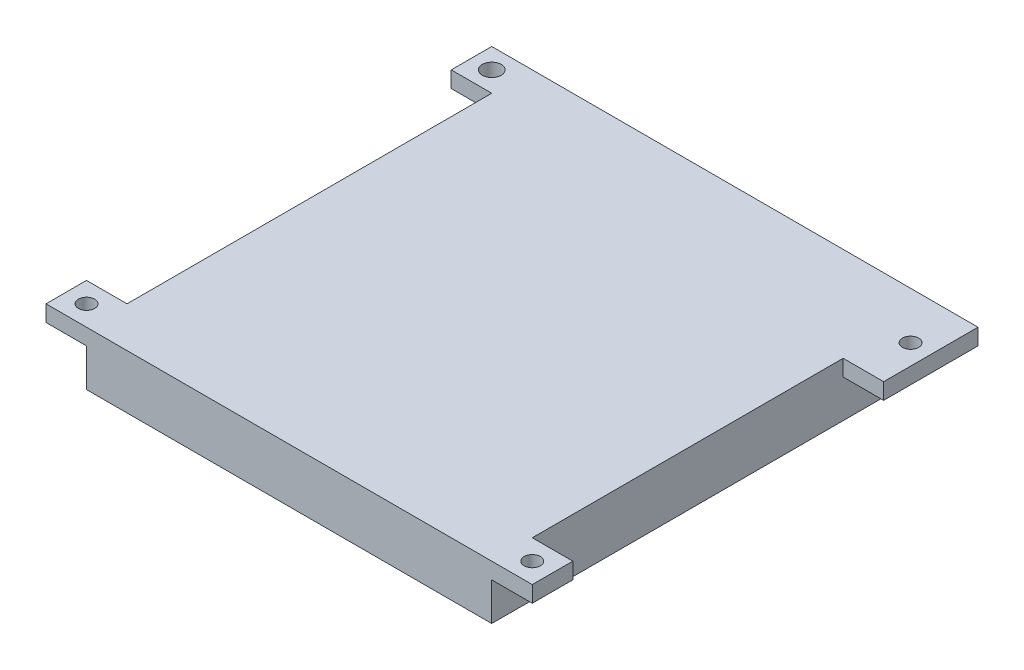
ISO-10303-21;
HEADER;
FILE_DESCRIPTION(('STEP AP214'),'2;1');
FILE_NAME('part.step','',(''),(''),'','','');
FILE_SCHEMA(('AUTOMOTIVE_DESIGN { 1 0 10303 214 1 1 1 1 }'));
ENDSEC;
DATA;
#1=APPLICATION_CONTEXT('core data for automotive mechanical design processes');
#2=APPLICATION_PROTOCOL_DEFINITION('international standard','automotive_design',2000,#1);
#3=PRODUCT_CONTEXT('',#1,'mechanical');
#4=PRODUCT('Part','Part','',(#3));
#5=PRODUCT_RELATED_PRODUCT_CATEGORY('part','',(#4));
#6=PRODUCT_DEFINITION_FORMATION('','',#4);
#7=PRODUCT_DEFINITION_CONTEXT('part definition',#1,'design');
#8=PRODUCT_DEFINITION('design','',#6,#7);
#9=PRODUCT_DEFINITION_SHAPE('','',#8);
#10=(LENGTH_UNIT() NAMED_UNIT(*) SI_UNIT(.MILLI.,.METRE.));
#11=(NAMED_UNIT(*) PLANE_ANGLE_UNIT() SI_UNIT($,.RADIAN.));
#12=(NAMED_UNIT(*) SI_UNIT($,.STERADIAN.) SOLID_ANGLE_UNIT());
#13=UNCERTAINTY_MEASURE_WITH_UNIT(LENGTH_MEASURE(1.E-05),#10,'distance_accuracy_value','');
#14=(GEOMETRIC_REPRESENTATION_CONTEXT(3) GLOBAL_UNCERTAINTY_ASSIGNED_CONTEXT((#13)) GLOBAL_UNIT_ASSIGNED_CONTEXT((#10,
#11,#12)) REPRESENTATION_CONTEXT('',''));
#15=CARTESIAN_POINT('',(0.,0.,0.));
#16=DIRECTION('',(0.,0.,1.));
#17=DIRECTION('',(1.,0.,0.));
#18=AXIS2_PLACEMENT_3D('',#15,#16,#17);
#19=CARTESIAN_POINT('',(199.999768598857,-20.,0.));
#20=DIRECTION('',(1.,0.,0.));
#21=DIRECTION('',(0.,0.,-1.));
#22=AXIS2_PLACEMENT_3D('',#19,#20,#21);
#23=PLANE('',#22);
#24=DIRECTION('',(0.,1.,0.));
#25=VECTOR('',#24,1.);
#26=CARTESIAN_POINT('',(199.999768598857,-6.,116.970063242651));
#27=LINE('',#26,#25);
#28=CARTESIAN_POINT('',(199.999768598857,-6.,116.970063242651));
#29=VERTEX_POINT('',#28);
#30=CARTESIAN_POINT('',(199.999768598857,0.,116.970063242651));
#31=VERTEX_POINT('',#30);
#32=EDGE_CURVE('E207',#29,#31,#27,.T.);
#33=ORIENTED_EDGE('',*,*,#32,.F.);
#34=DIRECTION('',(0.,0.,1.));
#35=VECTOR('',#34,1.);
#36=CARTESIAN_POINT('',(199.999768598857,-6.,131.970063242651));
#37=LINE('',#36,#35);
#38=CARTESIAN_POINT('',(199.999768598857,-6.,131.970063242651));
#39=VERTEX_POINT('',#38);
#40=EDGE_CURVE('E190',#29,#39,#37,.T.);
#41=ORIENTED_EDGE('',*,*,#40,.T.);
#42=DIRECTION('',(0.,1.,0.));
#43=VECTOR('',#42,1.);
#44=CARTESIAN_POINT('',(199.999768598857,-20.,131.970063242651));
#45=LINE('',#44,#43);
#46=CARTESIAN_POINT('',(199.999768598857,-20.,131.970063242651));
#47=VERTEX_POINT('',#46);
#48=EDGE_CURVE('E41',#47,#39,#45,.T.);
#49=ORIENTED_EDGE('',*,*,#48,.F.);
#50=DIRECTION('',(0.,0.,-1.));
#51=VECTOR('',#50,1.);
#52=CARTESIAN_POINT('',(199.999768598857,-20.,0.));
#53=LINE('',#52,#51);
#54=CARTESIAN_POINT('',(199.999768598857,-20.,-33.029936757349));
#55=VERTEX_POINT('',#54);
#56=EDGE_CURVE('E282',#47,#55,#53,.T.);
#57=ORIENTED_EDGE('',*,*,#56,.T.);
#58=DIRECTION('',(0.,1.,0.));
#59=VECTOR('',#58,1.);
#60=CARTESIAN_POINT('',(199.999768598857,-20.,-33.029936757349));
#61=LINE('',#60,#59);
#62=CARTESIAN_POINT('',(199.999768598857,-6.,-33.029936757349));
#63=VERTEX_POINT('',#62);
#64=EDGE_CURVE('E297',#55,#63,#61,.T.);
#65=ORIENTED_EDGE('',*,*,#64,.T.);
#66=DIRECTION('',(0.,0.,1.));
#67=VECTOR('',#66,1.);
#68=CARTESIAN_POINT('',(199.999768598857,-6.,-33.029936757349));
#69=LINE('',#68,#67);
#70=CARTESIAN_POINT('',(199.999768598857,-6.,1.89646795922593));
#71=VERTEX_POINT('',#70);
#72=EDGE_CURVE('E221',#63,#71,#69,.T.);
#73=ORIENTED_EDGE('',*,*,#72,.T.);
#74=DIRECTION('',(0.,1.,0.));
#75=VECTOR('',#74,1.);
#76=CARTESIAN_POINT('',(199.999768598857,-6.,1.89646795922593));
#77=LINE('',#76,#75);
#78=CARTESIAN_POINT('',(199.999768598857,0.,1.89646795922593));
#79=VERTEX_POINT('',#78);
#80=EDGE_CURVE('E234',#71,#79,#77,.T.);
#81=ORIENTED_EDGE('',*,*,#80,.T.);
#82=DIRECTION('',(0.,0.,-1.));
#83=VECTOR('',#82,1.);
#84=CARTESIAN_POINT('',(199.999768598857,0.,0.));
#85=LINE('',#84,#83);
#86=EDGE_CURVE('E291',#31,#79,#85,.T.);
#87=ORIENTED_EDGE('',*,*,#86,.F.);
#88=EDGE_LOOP('',(#33,#41,#49,#57,#65,#73,#81,#87));
#89=FACE_BOUND('',#88,.T.);
#90=ADVANCED_FACE('F37',(#89),#23,.T.);
#91=CARTESIAN_POINT('',(49.9997685988575,-20.,0.));
#92=DIRECTION('',(1.,0.,0.));
#93=DIRECTION('',(0.,0.,-1.));
#94=AXIS2_PLACEMENT_3D('',#91,#92,#93);
#95=PLANE('',#94);
#96=DIRECTION('',(0.,0.,-1.));
#97=VECTOR('',#96,1.);
#98=CARTESIAN_POINT('',(49.9997685988575,-6.,131.970063242651));
#99=LINE('',#98,#97);
#100=CARTESIAN_POINT('',(49.9997685988575,-6.,131.970063242651));
#101=VERTEX_POINT('',#100);
#102=CARTESIAN_POINT('',(49.9997685988575,-6.,116.970063242651));
#103=VERTEX_POINT('',#102);
#104=EDGE_CURVE('E53',#101,#103,#99,.T.);
#105=ORIENTED_EDGE('',*,*,#104,.T.);
#106=DIRECTION('',(0.,1.,0.));
#107=VECTOR('',#106,1.);
#108=CARTESIAN_POINT('',(49.9997685988575,-6.,116.970063242651));
#109=LINE('',#108,#107);
#110=CARTESIAN_POINT('',(49.9997685988575,0.,116.970063242651));
#111=VERTEX_POINT('',#110);
#112=EDGE_CURVE('E162',#103,#111,#109,.T.);
#113=ORIENTED_EDGE('',*,*,#112,.T.);
#114=DIRECTION('',(0.,0.,-1.));
#115=VECTOR('',#114,1.);
#116=CARTESIAN_POINT('',(49.9997685988575,0.,0.));
#117=LINE('',#116,#115);
#118=CARTESIAN_POINT('',(49.9997685988575,0.,-18.029936757349));
#119=VERTEX_POINT('',#118);
#120=EDGE_CURVE('E283',#111,#119,#117,.T.);
#121=ORIENTED_EDGE('',*,*,#120,.T.);
#122=DIRECTION('',(0.,1.,0.));
#123=VECTOR('',#122,1.);
#124=CARTESIAN_POINT('',(49.9997685988575,-6.,-18.029936757349));
#125=LINE('',#124,#123);
#126=CARTESIAN_POINT('',(49.9997685988575,-6.,-18.029936757349));
#127=VERTEX_POINT('',#126);
#128=EDGE_CURVE('E271',#127,#119,#125,.T.);
#129=ORIENTED_EDGE('',*,*,#128,.F.);
#130=DIRECTION('',(0.,0.,-1.));
#131=VECTOR('',#130,1.);
#132=CARTESIAN_POINT('',(49.9997685988575,-6.,-33.029936757349));
#133=LINE('',#132,#131);
#134=CARTESIAN_POINT('',(49.9997685988575,-6.,-33.029936757349));
#135=VERTEX_POINT('',#134);
#136=EDGE_CURVE('E253',#127,#135,#133,.T.);
#137=ORIENTED_EDGE('',*,*,#136,.T.);
#138=DIRECTION('',(0.,1.,0.));
#139=VECTOR('',#138,1.);
#140=CARTESIAN_POINT('',(49.9997685988575,-20.,-33.029936757349));
#141=LINE('',#140,#139);
#142=CARTESIAN_POINT('',(49.9997685988575,-20.,-33.029936757349));
#143=VERTEX_POINT('',#142);
#144=EDGE_CURVE('E46',#143,#135,#141,.T.);
#145=ORIENTED_EDGE('',*,*,#144,.F.);
#146=DIRECTION('',(0.,0.,-1.));
#147=VECTOR('',#146,1.);
#148=CARTESIAN_POINT('',(49.9997685988575,-20.,0.));
#149=LINE('',#148,#147);
#150=CARTESIAN_POINT('',(49.9997685988575,-20.,131.970063242651));
#151=VERTEX_POINT('',#150);
#152=EDGE_CURVE('E288',#151,#143,#149,.T.);
#153=ORIENTED_EDGE('',*,*,#152,.F.);
#154=DIRECTION('',(0.,1.,0.));
#155=VECTOR('',#154,1.);
#156=CARTESIAN_POINT('',(49.9997685988575,-20.,131.970063242651));
#157=LINE('',#156,#155);
#158=EDGE_CURVE('E11',#151,#101,#157,.T.);
#159=ORIENTED_EDGE('',*,*,#158,.T.);
#160=EDGE_LOOP('',(#105,#113,#121,#129,#137,#145,#153,#159));
#161=FACE_BOUND('',#160,.T.);
#162=ADVANCED_FACE('F337',(#161),#95,.F.);
#163=CARTESIAN_POINT('',(0.,-20.,131.970063242651));
#164=DIRECTION('',(0.,0.,1.));
#165=DIRECTION('',(1.,0.,0.));
#166=AXIS2_PLACEMENT_3D('',#163,#164,#165);
#167=PLANE('',#166);
#168=DIRECTION('',(1.,0.,0.));
#169=VECTOR('',#168,1.);
#170=CARTESIAN_POINT('',(0.,0.,131.970063242651));
#171=LINE('',#170,#169);
#172=CARTESIAN_POINT('',(34.9997685988575,0.,131.970063242651));
#173=VERTEX_POINT('',#172);
#174=CARTESIAN_POINT('',(214.999768598857,0.,131.970063242651));
#175=VERTEX_POINT('',#174);
#176=EDGE_CURVE('E274',#173,#175,#171,.T.);
#177=ORIENTED_EDGE('',*,*,#176,.F.);
#178=DIRECTION('',(0.,1.,0.));
#179=VECTOR('',#178,1.);
#180=CARTESIAN_POINT('',(34.9997685988575,-6.,131.970063242651));
#181=LINE('',#180,#179);
#182=CARTESIAN_POINT('',(34.9997685988575,-6.,131.970063242651));
#183=VERTEX_POINT('',#182);
#184=EDGE_CURVE('E161',#183,#173,#181,.T.);
#185=ORIENTED_EDGE('',*,*,#184,.F.);
#186=DIRECTION('',(1.,0.,0.));
#187=VECTOR('',#186,1.);
#188=CARTESIAN_POINT('',(49.9997685988575,-6.,131.970063242651));
#189=LINE('',#188,#187);
#190=EDGE_CURVE('E169',#183,#101,#189,.T.);
#191=ORIENTED_EDGE('',*,*,#190,.T.);
#192=ORIENTED_EDGE('',*,*,#158,.F.);
#193=DIRECTION('',(1.,0.,0.));
#194=VECTOR('',#193,1.);
#195=CARTESIAN_POINT('',(0.,-20.,131.970063242651));
#196=LINE('',#195,#194);
#197=EDGE_CURVE('E279',#151,#47,#196,.T.);
#198=ORIENTED_EDGE('',*,*,#197,.T.);
#199=ORIENTED_EDGE('',*,*,#48,.T.);
#200=DIRECTION('',(1.,0.,0.));
#201=VECTOR('',#200,1.);
#202=CARTESIAN_POINT('',(199.999768598857,-6.,131.970063242651));
#203=LINE('',#202,#201);
#204=CARTESIAN_POINT('',(214.999768598857,-6.,131.970063242651));
#205=VERTEX_POINT('',#204);
#206=EDGE_CURVE('E193',#39,#205,#203,.T.);
#207=ORIENTED_EDGE('',*,*,#206,.T.);
#208=DIRECTION('',(0.,1.,0.));
#209=VECTOR('',#208,1.);
#210=CARTESIAN_POINT('',(214.999768598857,-6.,131.970063242651));
#211=LINE('',#210,#209);
#212=EDGE_CURVE('E203',#205,#175,#211,.T.);
#213=ORIENTED_EDGE('',*,*,#212,.T.);
#214=EDGE_LOOP('',(#177,#185,#191,#192,#198,#199,#207,#213));
#215=FACE_BOUND('',#214,.T.);
#216=ADVANCED_FACE('F39',(#215),#167,.T.);
#217=CARTESIAN_POINT('',(0.,-20.,-33.029936757349));
#218=DIRECTION('',(0.,0.,1.));
#219=DIRECTION('',(1.,0.,0.));
#220=AXIS2_PLACEMENT_3D('',#217,#218,#219);
#221=PLANE('',#220);
#222=DIRECTION('',(1.,0.,0.));
#223=VECTOR('',#222,1.);
#224=CARTESIAN_POINT('',(0.,0.,-33.029936757349));
#225=LINE('',#224,#223);
#226=CARTESIAN_POINT('',(34.9997685988575,0.,-33.029936757349));
#227=VERTEX_POINT('',#226);
#228=CARTESIAN_POINT('',(214.999768598853,0.,-33.029936757349));
#229=VERTEX_POINT('',#228);
#230=EDGE_CURVE('E293',#227,#229,#225,.T.);
#231=ORIENTED_EDGE('',*,*,#230,.T.);
#232=DIRECTION('',(0.,1.,0.));
#233=VECTOR('',#232,1.);
#234=CARTESIAN_POINT('',(214.999768598853,-6.,-33.029936757349));
#235=LINE('',#234,#233);
#236=CARTESIAN_POINT('',(214.999768598853,-6.,-33.029936757349));
#237=VERTEX_POINT('',#236);
#238=EDGE_CURVE('E239',#237,#229,#235,.T.);
#239=ORIENTED_EDGE('',*,*,#238,.F.);
#240=DIRECTION('',(-1.,0.,0.));
#241=VECTOR('',#240,1.);
#242=CARTESIAN_POINT('',(199.999768598857,-6.,-33.029936757349));
#243=LINE('',#242,#241);
#244=EDGE_CURVE('E231',#237,#63,#243,.T.);
#245=ORIENTED_EDGE('',*,*,#244,.T.);
#246=ORIENTED_EDGE('',*,*,#64,.F.);
#247=DIRECTION('',(1.,0.,0.));
#248=VECTOR('',#247,1.);
#249=CARTESIAN_POINT('',(0.,-20.,-33.029936757349));
#250=LINE('',#249,#248);
#251=EDGE_CURVE('E286',#143,#55,#250,.T.);
#252=ORIENTED_EDGE('',*,*,#251,.F.);
#253=ORIENTED_EDGE('',*,*,#144,.T.);
#254=DIRECTION('',(-1.,0.,0.));
#255=VECTOR('',#254,1.);
#256=CARTESIAN_POINT('',(49.9997685988575,-6.,-33.029936757349));
#257=LINE('',#256,#255);
#258=CARTESIAN_POINT('',(34.9997685988575,-6.,-33.029936757349));
#259=VERTEX_POINT('',#258);
#260=EDGE_CURVE('E256',#135,#259,#257,.T.);
#261=ORIENTED_EDGE('',*,*,#260,.T.);
#262=DIRECTION('',(0.,1.,0.));
#263=VECTOR('',#262,1.);
#264=CARTESIAN_POINT('',(34.9997685988575,-6.,-33.029936757349));
#265=LINE('',#264,#263);
#266=EDGE_CURVE('E266',#259,#227,#265,.T.);
#267=ORIENTED_EDGE('',*,*,#266,.T.);
#268=EDGE_LOOP('',(#231,#239,#245,#246,#252,#253,#261,#267));
#269=FACE_BOUND('',#268,.T.);
#270=ADVANCED_FACE('F311',(#269),#221,.F.);
#271=CARTESIAN_POINT('',(0.,-20.,0.));
#272=DIRECTION('',(0.,1.,0.));
#273=DIRECTION('',(0.,0.,1.));
#274=AXIS2_PLACEMENT_3D('',#271,#272,#273);
#275=PLANE('',#274);
#276=CARTESIAN_POINT('',(142.578381334139,-20.,-20.5238064851316));
#277=DIRECTION('',(0.,-1.,0.));
#278=DIRECTION('',(0.,0.,-1.));
#279=AXIS2_PLACEMENT_3D('',#276,#277,#278);
#280=CIRCLE('',#279,2.99999999999999);
#281=CARTESIAN_POINT('',(142.578381334139,-20.,-23.5238064851315));
#282=VERTEX_POINT('',#281);
#283=EDGE_CURVE('E439',#282,#282,#280,.T.);
#284=ORIENTED_EDGE('',*,*,#283,.F.);
#285=EDGE_LOOP('',(#284));
#286=FACE_BOUND('',#285,.T.);
#287=CARTESIAN_POINT('',(68.5843739945448,-20.,46.7434729144997));
#288=DIRECTION('',(0.,-1.,0.));
#289=DIRECTION('',(0.,0.,-1.));
#290=AXIS2_PLACEMENT_3D('',#287,#288,#289);
#291=CIRCLE('',#290,3.00000000000001);
#292=CARTESIAN_POINT('',(68.5843739945448,-20.,43.7434729144997));
#293=VERTEX_POINT('',#292);
#294=EDGE_CURVE('E445',#293,#293,#291,.T.);
#295=ORIENTED_EDGE('',*,*,#294,.F.);
#296=EDGE_LOOP('',(#295));
#297=FACE_BOUND('',#296,.T.);
#298=CARTESIAN_POINT('',(163.836550467888,-20.,77.190523298585));
#299=DIRECTION('',(0.,-1.,0.));
#300=DIRECTION('',(0.,0.,-1.));
#301=AXIS2_PLACEMENT_3D('',#298,#299,#300);
#302=CIRCLE('',#301,2.99999999999999);
#303=CARTESIAN_POINT('',(163.836550467888,-20.,74.190523298585));
#304=VERTEX_POINT('',#303);
#305=EDGE_CURVE('E440',#304,#304,#302,.T.);
#306=ORIENTED_EDGE('',*,*,#305,.F.);
#307=EDGE_LOOP('',(#306));
#308=FACE_BOUND('',#307,.T.);
#309=ORIENTED_EDGE('',*,*,#197,.F.);
#310=ORIENTED_EDGE('',*,*,#152,.T.);
#311=ORIENTED_EDGE('',*,*,#251,.T.);
#312=ORIENTED_EDGE('',*,*,#56,.F.);
#313=EDGE_LOOP('',(#309,#310,#311,#312));
#314=FACE_BOUND('',#313,.T.);
#315=ADVANCED_FACE('F307',(#286,#297,#308,#314),#275,.F.);
#316=CARTESIAN_POINT('',(0.,0.,0.));
#317=DIRECTION('',(0.,1.,0.));
#318=DIRECTION('',(0.,0.,1.));
#319=AXIS2_PLACEMENT_3D('',#316,#317,#318);
#320=PLANE('',#319);
#321=ORIENTED_EDGE('',*,*,#176,.T.);
#322=DIRECTION('',(0.,0.,-1.));
#323=VECTOR('',#322,1.);
#324=CARTESIAN_POINT('',(214.999768598857,0.,131.970063242651));
#325=LINE('',#324,#323);
#326=CARTESIAN_POINT('',(214.999768598857,0.,116.970063242651));
#327=VERTEX_POINT('',#326);
#328=EDGE_CURVE('E187',#175,#327,#325,.T.);
#329=ORIENTED_EDGE('',*,*,#328,.T.);
#330=DIRECTION('',(-1.,0.,0.));
#331=VECTOR('',#330,1.);
#332=CARTESIAN_POINT('',(199.999768598857,0.,116.970063242651));
#333=LINE('',#332,#331);
#334=EDGE_CURVE('E194',#327,#31,#333,.T.);
#335=ORIENTED_EDGE('',*,*,#334,.T.);
#336=ORIENTED_EDGE('',*,*,#86,.T.);
#337=DIRECTION('',(1.,0.,0.));
#338=VECTOR('',#337,1.);
#339=CARTESIAN_POINT('',(199.999768598857,0.,1.89646795922593));
#340=LINE('',#339,#338);
#341=CARTESIAN_POINT('',(214.999768598853,0.,1.89646795922593));
#342=VERTEX_POINT('',#341);
#343=EDGE_CURVE('E218',#79,#342,#340,.T.);
#344=ORIENTED_EDGE('',*,*,#343,.T.);
#345=DIRECTION('',(0.,0.,-1.));
#346=VECTOR('',#345,1.);
#347=CARTESIAN_POINT('',(214.999768598853,0.,-33.029936757349));
#348=LINE('',#347,#346);
#349=EDGE_CURVE('E225',#342,#229,#348,.T.);
#350=ORIENTED_EDGE('',*,*,#349,.T.);
#351=ORIENTED_EDGE('',*,*,#230,.F.);
#352=DIRECTION('',(0.,0.,1.));
#353=VECTOR('',#352,1.);
#354=CARTESIAN_POINT('',(34.9997685988575,0.,-33.029936757349));
#355=LINE('',#354,#353);
#356=CARTESIAN_POINT('',(34.9997685988575,0.,-18.029936757349));
#357=VERTEX_POINT('',#356);
#358=EDGE_CURVE('E250',#227,#357,#355,.T.);
#359=ORIENTED_EDGE('',*,*,#358,.T.);
#360=DIRECTION('',(1.,0.,0.));
#361=VECTOR('',#360,1.);
#362=CARTESIAN_POINT('',(49.9997685988575,0.,-18.029936757349));
#363=LINE('',#362,#361);
#364=EDGE_CURVE('E257',#357,#119,#363,.T.);
#365=ORIENTED_EDGE('',*,*,#364,.T.);
#366=ORIENTED_EDGE('',*,*,#120,.F.);
#367=DIRECTION('',(-1.,0.,0.));
#368=VECTOR('',#367,1.);
#369=CARTESIAN_POINT('',(49.9997685988575,0.,116.970063242651));
#370=LINE('',#369,#368);
#371=CARTESIAN_POINT('',(34.9997685988575,0.,116.970063242651));
#372=VERTEX_POINT('',#371);
#373=EDGE_CURVE('E177',#111,#372,#370,.T.);
#374=ORIENTED_EDGE('',*,*,#373,.T.);
#375=DIRECTION('',(0.,0.,1.));
#376=VECTOR('',#375,1.);
#377=CARTESIAN_POINT('',(34.9997685988575,0.,131.970063242651));
#378=LINE('',#377,#376);
#379=EDGE_CURVE('E156',#372,#173,#378,.T.);
#380=ORIENTED_EDGE('',*,*,#379,.T.);
#381=EDGE_LOOP('',(#321,#329,#335,#336,#344,#350,#351,#359,#365,#366,#374,#380));
#382=FACE_BOUND('',#381,.T.);
#383=CARTESIAN_POINT('',(42.4997685988575,0.,-25.529936757349));
#384=DIRECTION('',(0.,1.,0.));
#385=DIRECTION('',(0.,0.,1.));
#386=AXIS2_PLACEMENT_3D('',#383,#384,#385);
#387=CIRCLE('',#386,3.50000000000001);
#388=CARTESIAN_POINT('',(42.4997685988575,0.,-22.029936757349));
#389=VERTEX_POINT('',#388);
#390=EDGE_CURVE('E242',#389,#389,#387,.T.);
#391=ORIENTED_EDGE('',*,*,#390,.F.);
#392=EDGE_LOOP('',(#391));
#393=FACE_BOUND('',#392,.T.);
#394=CARTESIAN_POINT('',(207.499768598855,0.,-15.5667343990615));
#395=DIRECTION('',(0.,1.,0.));
#396=DIRECTION('',(0.,0.,1.));
#397=AXIS2_PLACEMENT_3D('',#394,#395,#396);
#398=CIRCLE('',#397,2.99999999999999);
#399=CARTESIAN_POINT('',(207.499768598855,0.,-12.5667343990615));
#400=VERTEX_POINT('',#399);
#401=EDGE_CURVE('E210',#400,#400,#398,.T.);
#402=ORIENTED_EDGE('',*,*,#401,.F.);
#403=EDGE_LOOP('',(#402));
#404=FACE_BOUND('',#403,.T.);
#405=CARTESIAN_POINT('',(207.499768598857,0.,124.470063242651));
#406=DIRECTION('',(0.,1.,0.));
#407=DIRECTION('',(0.,0.,1.));
#408=AXIS2_PLACEMENT_3D('',#405,#406,#407);
#409=CIRCLE('',#408,2.99999999999999);
#410=CARTESIAN_POINT('',(207.499768598857,0.,127.470063242651));
#411=VERTEX_POINT('',#410);
#412=EDGE_CURVE('E181',#411,#411,#409,.T.);
#413=ORIENTED_EDGE('',*,*,#412,.F.);
#414=EDGE_LOOP('',(#413));
#415=FACE_BOUND('',#414,.T.);
#416=CARTESIAN_POINT('',(42.4997685988575,0.,124.470063242651));
#417=DIRECTION('',(0.,1.,0.));
#418=DIRECTION('',(0.,0.,1.));
#419=AXIS2_PLACEMENT_3D('',#416,#417,#418);
#420=CIRCLE('',#419,3.00000000000001);
#421=CARTESIAN_POINT('',(42.4997685988575,0.,127.470063242651));
#422=VERTEX_POINT('',#421);
#423=EDGE_CURVE('E454',#422,#422,#420,.T.);
#424=ORIENTED_EDGE('',*,*,#423,.F.);
#425=EDGE_LOOP('',(#424));
#426=FACE_BOUND('',#425,.T.);
#427=ADVANCED_FACE('F323',(#382,#393,#404,#415,#426),#320,.T.);
#428=CARTESIAN_POINT('',(49.9997685988575,-6.,-18.029936757349));
#429=DIRECTION('',(0.,0.,1.));
#430=DIRECTION('',(1.,0.,0.));
#431=AXIS2_PLACEMENT_3D('',#428,#429,#430);
#432=PLANE('',#431);
#433=ORIENTED_EDGE('',*,*,#364,.F.);
#434=DIRECTION('',(0.,1.,0.));
#435=VECTOR('',#434,1.);
#436=CARTESIAN_POINT('',(34.9997685988575,-6.,-18.029936757349));
#437=LINE('',#436,#435);
#438=CARTESIAN_POINT('',(34.9997685988575,-6.,-18.029936757349));
#439=VERTEX_POINT('',#438);
#440=EDGE_CURVE('E275',#439,#357,#437,.T.);
#441=ORIENTED_EDGE('',*,*,#440,.F.);
#442=DIRECTION('',(1.,0.,0.));
#443=VECTOR('',#442,1.);
#444=CARTESIAN_POINT('',(49.9997685988575,-6.,-18.029936757349));
#445=LINE('',#444,#443);
#446=EDGE_CURVE('E263',#439,#127,#445,.T.);
#447=ORIENTED_EDGE('',*,*,#446,.T.);
#448=ORIENTED_EDGE('',*,*,#128,.T.);
#449=EDGE_LOOP('',(#433,#441,#447,#448));
#450=FACE_BOUND('',#449,.T.);
#451=ADVANCED_FACE('F355',(#450),#432,.T.);
#452=CARTESIAN_POINT('',(34.9997685988575,-6.,-33.029936757349));
#453=DIRECTION('',(-1.,0.,0.));
#454=DIRECTION('',(0.,0.,1.));
#455=AXIS2_PLACEMENT_3D('',#452,#453,#454);
#456=PLANE('',#455);
#457=ORIENTED_EDGE('',*,*,#358,.F.);
#458=ORIENTED_EDGE('',*,*,#266,.F.);
#459=DIRECTION('',(0.,0.,1.));
#460=VECTOR('',#459,1.);
#461=CARTESIAN_POINT('',(34.9997685988575,-6.,-33.029936757349));
#462=LINE('',#461,#460);
#463=EDGE_CURVE('E260',#259,#439,#462,.T.);
#464=ORIENTED_EDGE('',*,*,#463,.T.);
#465=ORIENTED_EDGE('',*,*,#440,.T.);
#466=EDGE_LOOP('',(#457,#458,#464,#465));
#467=FACE_BOUND('',#466,.T.);
#468=ADVANCED_FACE('F359',(#467),#456,.T.);
#469=CARTESIAN_POINT('',(0.,-6.,0.));
#470=DIRECTION('',(0.,-1.,0.));
#471=DIRECTION('',(0.,0.,-1.));
#472=AXIS2_PLACEMENT_3D('',#469,#470,#471);
#473=PLANE('',#472);
#474=CARTESIAN_POINT('',(42.4997685988575,-6.,-25.529936757349));
#475=DIRECTION('',(0.,1.,0.));
#476=DIRECTION('',(0.,0.,1.));
#477=AXIS2_PLACEMENT_3D('',#474,#475,#476);
#478=CIRCLE('',#477,3.50000000000001);
#479=CARTESIAN_POINT('',(42.4997685988575,-6.,-22.029936757349));
#480=VERTEX_POINT('',#479);
#481=EDGE_CURVE('E247',#480,#480,#478,.T.);
#482=ORIENTED_EDGE('',*,*,#481,.T.);
#483=EDGE_LOOP('',(#482));
#484=FACE_BOUND('',#483,.T.);
#485=ORIENTED_EDGE('',*,*,#136,.F.);
#486=ORIENTED_EDGE('',*,*,#446,.F.);
#487=ORIENTED_EDGE('',*,*,#463,.F.);
#488=ORIENTED_EDGE('',*,*,#260,.F.);
#489=EDGE_LOOP('',(#485,#486,#487,#488));
#490=FACE_BOUND('',#489,.T.);
#491=ADVANCED_FACE('F362',(#484,#490),#473,.T.);
#492=CARTESIAN_POINT('',(42.4997685988575,-6.,-25.529936757349));
#493=DIRECTION('',(0.,1.,0.));
#494=DIRECTION('',(0.,0.,1.));
#495=AXIS2_PLACEMENT_3D('',#492,#493,#494);
#496=CYLINDRICAL_SURFACE('',#495,3.50000000000001);
#497=ORIENTED_EDGE('',*,*,#481,.F.);
#498=EDGE_LOOP('',(#497));
#499=FACE_BOUND('',#498,.T.);
#500=ORIENTED_EDGE('',*,*,#390,.T.);
#501=EDGE_LOOP('',(#500));
#502=FACE_BOUND('',#501,.T.);
#503=ADVANCED_FACE('F369',(#499,#502),#496,.F.);
#504=CARTESIAN_POINT('',(214.999768598853,-6.,-33.029936757349));
#505=DIRECTION('',(1.,0.,0.));
#506=DIRECTION('',(0.,0.,-1.));
#507=AXIS2_PLACEMENT_3D('',#504,#505,#506);
#508=PLANE('',#507);
#509=ORIENTED_EDGE('',*,*,#349,.F.);
#510=DIRECTION('',(0.,1.,0.));
#511=VECTOR('',#510,1.);
#512=CARTESIAN_POINT('',(214.999768598853,-6.,1.89646795922593));
#513=LINE('',#512,#511);
#514=CARTESIAN_POINT('',(214.999768598853,-6.,1.89646795922593));
#515=VERTEX_POINT('',#514);
#516=EDGE_CURVE('E243',#515,#342,#513,.T.);
#517=ORIENTED_EDGE('',*,*,#516,.F.);
#518=DIRECTION('',(0.,0.,-1.));
#519=VECTOR('',#518,1.);
#520=CARTESIAN_POINT('',(214.999768598853,-6.,-33.029936757349));
#521=LINE('',#520,#519);
#522=EDGE_CURVE('E228',#515,#237,#521,.T.);
#523=ORIENTED_EDGE('',*,*,#522,.T.);
#524=ORIENTED_EDGE('',*,*,#238,.T.);
#525=EDGE_LOOP('',(#509,#517,#523,#524));
#526=FACE_BOUND('',#525,.T.);
#527=ADVANCED_FACE('F373',(#526),#508,.T.);
#528=CARTESIAN_POINT('',(199.999768598857,-6.,1.89646795922593));
#529=DIRECTION('',(0.,0.,1.));
#530=DIRECTION('',(1.,0.,0.));
#531=AXIS2_PLACEMENT_3D('',#528,#529,#530);
#532=PLANE('',#531);
#533=ORIENTED_EDGE('',*,*,#343,.F.);
#534=ORIENTED_EDGE('',*,*,#80,.F.);
#535=DIRECTION('',(1.,0.,0.));
#536=VECTOR('',#535,1.);
#537=CARTESIAN_POINT('',(199.999768598857,-6.,1.89646795922593));
#538=LINE('',#537,#536);
#539=EDGE_CURVE('E224',#71,#515,#538,.T.);
#540=ORIENTED_EDGE('',*,*,#539,.T.);
#541=ORIENTED_EDGE('',*,*,#516,.T.);
#542=EDGE_LOOP('',(#533,#534,#540,#541));
#543=FACE_BOUND('',#542,.T.);
#544=ADVANCED_FACE('F320',(#543),#532,.T.);
#545=CARTESIAN_POINT('',(0.,-6.,0.));
#546=DIRECTION('',(0.,1.,0.));
#547=DIRECTION('',(0.,0.,1.));
#548=AXIS2_PLACEMENT_3D('',#545,#546,#547);
#549=PLANE('',#548);
#550=CARTESIAN_POINT('',(207.499768598855,-6.,-15.5667343990615));
#551=DIRECTION('',(0.,1.,0.));
#552=DIRECTION('',(0.,0.,1.));
#553=AXIS2_PLACEMENT_3D('',#550,#551,#552);
#554=CIRCLE('',#553,2.99999999999999);
#555=CARTESIAN_POINT('',(207.499768598855,-6.,-12.5667343990615));
#556=VERTEX_POINT('',#555);
#557=EDGE_CURVE('E215',#556,#556,#554,.T.);
#558=ORIENTED_EDGE('',*,*,#557,.T.);
#559=EDGE_LOOP('',(#558));
#560=FACE_BOUND('',#559,.T.);
#561=ORIENTED_EDGE('',*,*,#72,.F.);
#562=ORIENTED_EDGE('',*,*,#244,.F.);
#563=ORIENTED_EDGE('',*,*,#522,.F.);
#564=ORIENTED_EDGE('',*,*,#539,.F.);
#565=EDGE_LOOP('',(#561,#562,#563,#564));
#566=FACE_BOUND('',#565,.T.);
#567=ADVANCED_FACE('F315',(#560,#566),#549,.F.);
#568=CARTESIAN_POINT('',(207.499768598855,-6.,-15.5667343990615));
#569=DIRECTION('',(0.,1.,0.));
#570=DIRECTION('',(0.,0.,1.));
#571=AXIS2_PLACEMENT_3D('',#568,#569,#570);
#572=CYLINDRICAL_SURFACE('',#571,2.99999999999999);
#573=ORIENTED_EDGE('',*,*,#557,.F.);
#574=EDGE_LOOP('',(#573));
#575=FACE_BOUND('',#574,.T.);
#576=ORIENTED_EDGE('',*,*,#401,.T.);
#577=EDGE_LOOP('',(#576));
#578=FACE_BOUND('',#577,.T.);
#579=ADVANCED_FACE('F382',(#575,#578),#572,.F.);
#580=CARTESIAN_POINT('',(199.999768598857,-6.,116.970063242651));
#581=DIRECTION('',(0.,0.,-1.));
#582=DIRECTION('',(-1.,0.,0.));
#583=AXIS2_PLACEMENT_3D('',#580,#581,#582);
#584=PLANE('',#583);
#585=ORIENTED_EDGE('',*,*,#334,.F.);
#586=DIRECTION('',(0.,1.,0.));
#587=VECTOR('',#586,1.);
#588=CARTESIAN_POINT('',(214.999768598857,-6.,116.970063242651));
#589=LINE('',#588,#587);
#590=CARTESIAN_POINT('',(214.999768598857,-6.,116.970063242651));
#591=VERTEX_POINT('',#590);
#592=EDGE_CURVE('E211',#591,#327,#589,.T.);
#593=ORIENTED_EDGE('',*,*,#592,.F.);
#594=DIRECTION('',(-1.,0.,0.));
#595=VECTOR('',#594,1.);
#596=CARTESIAN_POINT('',(199.999768598857,-6.,116.970063242651));
#597=LINE('',#596,#595);
#598=EDGE_CURVE('E200',#591,#29,#597,.T.);
#599=ORIENTED_EDGE('',*,*,#598,.T.);
#600=ORIENTED_EDGE('',*,*,#32,.T.);
#601=EDGE_LOOP('',(#585,#593,#599,#600));
#602=FACE_BOUND('',#601,.T.);
#603=ADVANCED_FACE('F328',(#602),#584,.T.);
#604=CARTESIAN_POINT('',(214.999768598857,-6.,131.970063242651));
#605=DIRECTION('',(1.,0.,0.));
#606=DIRECTION('',(0.,0.,-1.));
#607=AXIS2_PLACEMENT_3D('',#604,#605,#606);
#608=PLANE('',#607);
#609=ORIENTED_EDGE('',*,*,#328,.F.);
#610=ORIENTED_EDGE('',*,*,#212,.F.);
#611=DIRECTION('',(0.,0.,-1.));
#612=VECTOR('',#611,1.);
#613=CARTESIAN_POINT('',(214.999768598857,-6.,131.970063242651));
#614=LINE('',#613,#612);
#615=EDGE_CURVE('E197',#205,#591,#614,.T.);
#616=ORIENTED_EDGE('',*,*,#615,.T.);
#617=ORIENTED_EDGE('',*,*,#592,.T.);
#618=EDGE_LOOP('',(#609,#610,#616,#617));
#619=FACE_BOUND('',#618,.T.);
#620=ADVANCED_FACE('F334',(#619),#608,.T.);
#621=CARTESIAN_POINT('',(0.,-6.,0.));
#622=DIRECTION('',(0.,-1.,0.));
#623=DIRECTION('',(0.,0.,-1.));
#624=AXIS2_PLACEMENT_3D('',#621,#622,#623);
#625=PLANE('',#624);
#626=CARTESIAN_POINT('',(207.499768598857,-6.,124.470063242651));
#627=DIRECTION('',(0.,1.,0.));
#628=DIRECTION('',(0.,0.,1.));
#629=AXIS2_PLACEMENT_3D('',#626,#627,#628);
#630=CIRCLE('',#629,2.99999999999999);
#631=CARTESIAN_POINT('',(207.499768598857,-6.,127.470063242651));
#632=VERTEX_POINT('',#631);
#633=EDGE_CURVE('E184',#632,#632,#630,.T.);
#634=ORIENTED_EDGE('',*,*,#633,.T.);
#635=EDGE_LOOP('',(#634));
#636=FACE_BOUND('',#635,.T.);
#637=ORIENTED_EDGE('',*,*,#40,.F.);
#638=ORIENTED_EDGE('',*,*,#598,.F.);
#639=ORIENTED_EDGE('',*,*,#615,.F.);
#640=ORIENTED_EDGE('',*,*,#206,.F.);
#641=EDGE_LOOP('',(#637,#638,#639,#640));
#642=FACE_BOUND('',#641,.T.);
#643=ADVANCED_FACE('F332',(#636,#642),#625,.T.);
#644=CARTESIAN_POINT('',(207.499768598857,-6.,124.470063242651));
#645=DIRECTION('',(0.,1.,0.));
#646=DIRECTION('',(0.,0.,1.));
#647=AXIS2_PLACEMENT_3D('',#644,#645,#646);
#648=CYLINDRICAL_SURFACE('',#647,2.99999999999999);
#649=ORIENTED_EDGE('',*,*,#633,.F.);
#650=EDGE_LOOP('',(#649));
#651=FACE_BOUND('',#650,.T.);
#652=ORIENTED_EDGE('',*,*,#412,.T.);
#653=EDGE_LOOP('',(#652));
#654=FACE_BOUND('',#653,.T.);
#655=ADVANCED_FACE('F393',(#651,#654),#648,.F.);
#656=CARTESIAN_POINT('',(34.9997685988575,-6.,131.970063242651));
#657=DIRECTION('',(-1.,0.,0.));
#658=DIRECTION('',(0.,0.,1.));
#659=AXIS2_PLACEMENT_3D('',#656,#657,#658);
#660=PLANE('',#659);
#661=ORIENTED_EDGE('',*,*,#379,.F.);
#662=DIRECTION('',(0.,1.,0.));
#663=VECTOR('',#662,1.);
#664=CARTESIAN_POINT('',(34.9997685988575,-6.,116.970063242651));
#665=LINE('',#664,#663);
#666=CARTESIAN_POINT('',(34.9997685988575,-6.,116.970063242651));
#667=VERTEX_POINT('',#666);
#668=EDGE_CURVE('E149',#667,#372,#665,.T.);
#669=ORIENTED_EDGE('',*,*,#668,.F.);
#670=DIRECTION('',(0.,0.,1.));
#671=VECTOR('',#670,1.);
#672=CARTESIAN_POINT('',(34.9997685988575,-6.,131.970063242651));
#673=LINE('',#672,#671);
#674=EDGE_CURVE('E153',#667,#183,#673,.T.);
#675=ORIENTED_EDGE('',*,*,#674,.T.);
#676=ORIENTED_EDGE('',*,*,#184,.T.);
#677=EDGE_LOOP('',(#661,#669,#675,#676));
#678=FACE_BOUND('',#677,.T.);
#679=ADVANCED_FACE('F151',(#678),#660,.T.);
#680=CARTESIAN_POINT('',(49.9997685988575,-6.,116.970063242651));
#681=DIRECTION('',(0.,0.,-1.));
#682=DIRECTION('',(-1.,0.,0.));
#683=AXIS2_PLACEMENT_3D('',#680,#681,#682);
#684=PLANE('',#683);
#685=ORIENTED_EDGE('',*,*,#373,.F.);
#686=ORIENTED_EDGE('',*,*,#112,.F.);
#687=DIRECTION('',(-1.,0.,0.));
#688=VECTOR('',#687,1.);
#689=CARTESIAN_POINT('',(49.9997685988575,-6.,116.970063242651));
#690=LINE('',#689,#688);
#691=EDGE_CURVE('E167',#103,#667,#690,.T.);
#692=ORIENTED_EDGE('',*,*,#691,.T.);
#693=ORIENTED_EDGE('',*,*,#668,.T.);
#694=EDGE_LOOP('',(#685,#686,#692,#693));
#695=FACE_BOUND('',#694,.T.);
#696=ADVANCED_FACE('F171',(#695),#684,.T.);
#697=CARTESIAN_POINT('',(0.,-6.,0.));
#698=DIRECTION('',(0.,1.,0.));
#699=DIRECTION('',(0.,0.,1.));
#700=AXIS2_PLACEMENT_3D('',#697,#698,#699);
#701=PLANE('',#700);
#702=CARTESIAN_POINT('',(42.4997685988575,-6.,124.470063242651));
#703=DIRECTION('',(0.,1.,0.));
#704=DIRECTION('',(0.,0.,1.));
#705=AXIS2_PLACEMENT_3D('',#702,#703,#704);
#706=CIRCLE('',#705,3.00000000000001);
#707=CARTESIAN_POINT('',(42.4997685988575,-6.,127.470063242651));
#708=VERTEX_POINT('',#707);
#709=EDGE_CURVE('E179',#708,#708,#706,.T.);
#710=ORIENTED_EDGE('',*,*,#709,.T.);
#711=EDGE_LOOP('',(#710));
#712=FACE_BOUND('',#711,.T.);
#713=ORIENTED_EDGE('',*,*,#104,.F.);
#714=ORIENTED_EDGE('',*,*,#190,.F.);
#715=ORIENTED_EDGE('',*,*,#674,.F.);
#716=ORIENTED_EDGE('',*,*,#691,.F.);
#717=EDGE_LOOP('',(#713,#714,#715,#716));
#718=FACE_BOUND('',#717,.T.);
#719=ADVANCED_FACE('F166',(#712,#718),#701,.F.);
#720=CARTESIAN_POINT('',(42.4997685988575,-6.,124.470063242651));
#721=DIRECTION('',(0.,1.,0.));
#722=DIRECTION('',(0.,0.,1.));
#723=AXIS2_PLACEMENT_3D('',#720,#721,#722);
#724=CYLINDRICAL_SURFACE('',#723,3.00000000000001);
#725=ORIENTED_EDGE('',*,*,#709,.F.);
#726=EDGE_LOOP('',(#725));
#727=FACE_BOUND('',#726,.T.);
#728=ORIENTED_EDGE('',*,*,#423,.T.);
#729=EDGE_LOOP('',(#728));
#730=FACE_BOUND('',#729,.T.);
#731=ADVANCED_FACE('F404',(#727,#730),#724,.F.);
#732=CARTESIAN_POINT('',(163.836550467888,-5.,77.190523298585));
#733=DIRECTION('',(0.,-1.,0.));
#734=DIRECTION('',(0.,0.,-1.));
#735=AXIS2_PLACEMENT_3D('',#732,#733,#734);
#736=CYLINDRICAL_SURFACE('',#735,2.99999999999999);
#737=CARTESIAN_POINT('',(163.836550467888,-5.,77.190523298585));
#738=DIRECTION('',(0.,-1.,0.));
#739=DIRECTION('',(0.,0.,-1.));
#740=AXIS2_PLACEMENT_3D('',#737,#738,#739);
#741=CIRCLE('',#740,2.99999999999999);
#742=CARTESIAN_POINT('',(163.836550467888,-5.,74.190523298585));
#743=VERTEX_POINT('',#742);
#744=EDGE_CURVE('E443',#743,#743,#741,.T.);
#745=ORIENTED_EDGE('',*,*,#744,.F.);
#746=EDGE_LOOP('',(#745));
#747=FACE_BOUND('',#746,.T.);
#748=ORIENTED_EDGE('',*,*,#305,.T.);
#749=EDGE_LOOP('',(#748));
#750=FACE_BOUND('',#749,.T.);
#751=ADVANCED_FACE('F408',(#747,#750),#736,.F.);
#752=CARTESIAN_POINT('',(163.836550467888,-5.,77.190523298585));
#753=DIRECTION('',(0.,-1.,0.));
#754=DIRECTION('',(0.,0.,-1.));
#755=AXIS2_PLACEMENT_3D('',#752,#753,#754);
#756=PLANE('',#755);
#757=ORIENTED_EDGE('',*,*,#744,.T.);
#758=EDGE_LOOP('',(#757));
#759=FACE_BOUND('',#758,.T.);
#760=ADVANCED_FACE('F412',(#759),#756,.T.);
#761=CARTESIAN_POINT('',(68.5843739945448,-5.,46.7434729144997));
#762=DIRECTION('',(0.,-1.,0.));
#763=DIRECTION('',(0.,0.,-1.));
#764=AXIS2_PLACEMENT_3D('',#761,#762,#763);
#765=CYLINDRICAL_SURFACE('',#764,3.00000000000001);
#766=CARTESIAN_POINT('',(68.5843739945448,-5.,46.7434729144997));
#767=DIRECTION('',(0.,-1.,0.));
#768=DIRECTION('',(0.,0.,-1.));
#769=AXIS2_PLACEMENT_3D('',#766,#767,#768);
#770=CIRCLE('',#769,3.00000000000001);
#771=CARTESIAN_POINT('',(68.5843739945448,-5.,43.7434729144997));
#772=VERTEX_POINT('',#771);
#773=EDGE_CURVE('E450',#772,#772,#770,.T.);
#774=ORIENTED_EDGE('',*,*,#773,.F.);
#775=EDGE_LOOP('',(#774));
#776=FACE_BOUND('',#775,.T.);
#777=ORIENTED_EDGE('',*,*,#294,.T.);
#778=EDGE_LOOP('',(#777));
#779=FACE_BOUND('',#778,.T.);
#780=ADVANCED_FACE('F416',(#776,#779),#765,.F.);
#781=CARTESIAN_POINT('',(68.5843739945448,-5.,46.7434729144997));
#782=DIRECTION('',(0.,-1.,0.));
#783=DIRECTION('',(0.,0.,-1.));
#784=AXIS2_PLACEMENT_3D('',#781,#782,#783);
#785=PLANE('',#784);
#786=ORIENTED_EDGE('',*,*,#773,.T.);
#787=EDGE_LOOP('',(#786));
#788=FACE_BOUND('',#787,.T.);
#789=ADVANCED_FACE('F418',(#788),#785,.T.);
#790=CARTESIAN_POINT('',(142.578381334139,-5.,-20.5238064851316));
#791=DIRECTION('',(0.,-1.,0.));
#792=DIRECTION('',(0.,0.,-1.));
#793=AXIS2_PLACEMENT_3D('',#790,#791,#792);
#794=CYLINDRICAL_SURFACE('',#793,2.99999999999999);
#795=CARTESIAN_POINT('',(142.578381334139,-5.,-20.5238064851316));
#796=DIRECTION('',(0.,-1.,0.));
#797=DIRECTION('',(0.,0.,-1.));
#798=AXIS2_PLACEMENT_3D('',#795,#796,#797);
#799=CIRCLE('',#798,2.99999999999999);
#800=CARTESIAN_POINT('',(142.578381334139,-5.,-23.5238064851315));
#801=VERTEX_POINT('',#800);
#802=EDGE_CURVE('E437',#801,#801,#799,.T.);
#803=ORIENTED_EDGE('',*,*,#802,.F.);
#804=EDGE_LOOP('',(#803));
#805=FACE_BOUND('',#804,.T.);
#806=ORIENTED_EDGE('',*,*,#283,.T.);
#807=EDGE_LOOP('',(#806));
#808=FACE_BOUND('',#807,.T.);
#809=ADVANCED_FACE('F421',(#805,#808),#794,.F.);
#810=CARTESIAN_POINT('',(142.578381334139,-5.,-20.5238064851316));
#811=DIRECTION('',(0.,-1.,0.));
#812=DIRECTION('',(0.,0.,-1.));
#813=AXIS2_PLACEMENT_3D('',#810,#811,#812);
#814=PLANE('',#813);
#815=ORIENTED_EDGE('',*,*,#802,.T.);
#816=EDGE_LOOP('',(#815));
#817=FACE_BOUND('',#816,.T.);
#818=ADVANCED_FACE('F426',(#817),#814,.T.);
#819=CLOSED_SHELL('',(#90,#162,#216,#270,#315,#427,#451,#468,#491,#503,#527,#544,#567,#579,#603,
#620,#643,#655,#679,#696,#719,#731,#751,#760,#780,#789,#809,#818));
#820=MANIFOLD_SOLID_BREP('B2',#819);
#821=ADVANCED_BREP_SHAPE_REPRESENTATION('',(#18,#820),#14);
#822=SHAPE_DEFINITION_REPRESENTATION(#9,#821);
ENDSEC;
END-ISO-10303-21;
